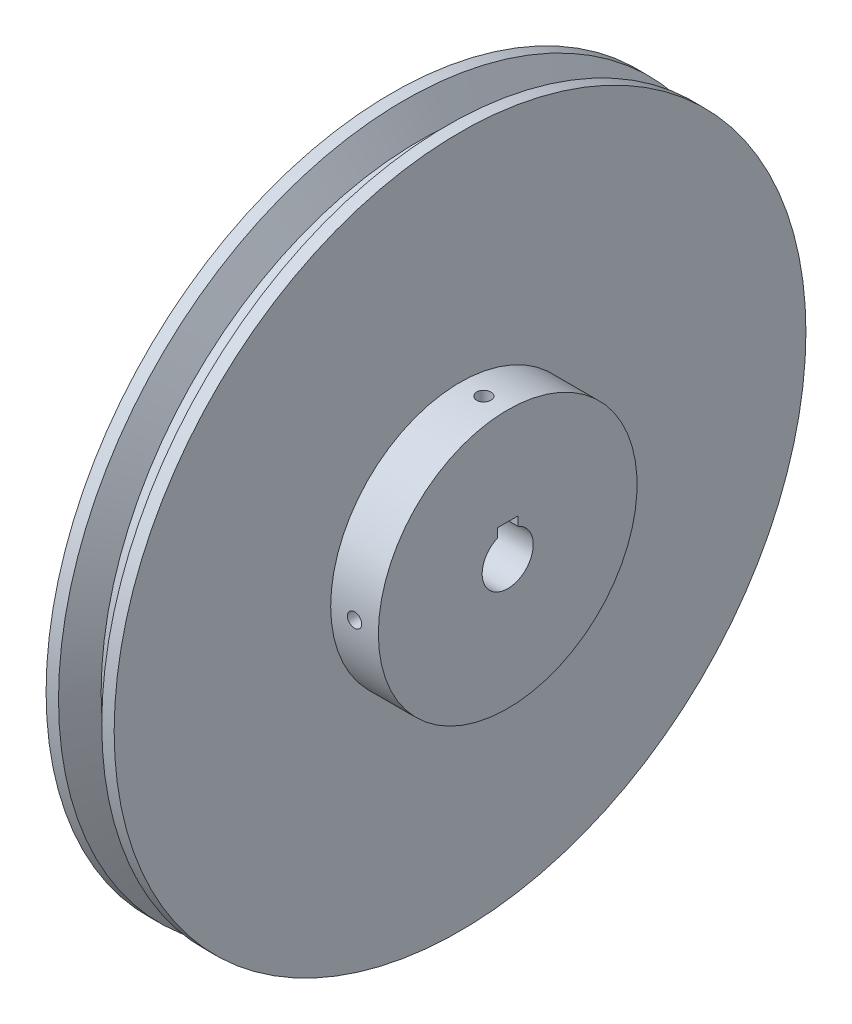
ISO-10303-21;
HEADER;
FILE_DESCRIPTION(('STEP AP214'),'2;1');
FILE_NAME('part.step','',(''),(''),'','','');
FILE_SCHEMA(('AUTOMOTIVE_DESIGN { 1 0 10303 214 1 1 1 1 }'));
ENDSEC;
DATA;
#1=APPLICATION_CONTEXT('core data for automotive mechanical design processes');
#2=APPLICATION_PROTOCOL_DEFINITION('international standard','automotive_design',2000,#1);
#3=PRODUCT_CONTEXT('',#1,'mechanical');
#4=PRODUCT('Part','Part','',(#3));
#5=PRODUCT_RELATED_PRODUCT_CATEGORY('part','',(#4));
#6=PRODUCT_DEFINITION_FORMATION('','',#4);
#7=PRODUCT_DEFINITION_CONTEXT('part definition',#1,'design');
#8=PRODUCT_DEFINITION('design','',#6,#7);
#9=PRODUCT_DEFINITION_SHAPE('','',#8);
#10=(LENGTH_UNIT() NAMED_UNIT(*) SI_UNIT(.MILLI.,.METRE.));
#11=(NAMED_UNIT(*) PLANE_ANGLE_UNIT() SI_UNIT($,.RADIAN.));
#12=(NAMED_UNIT(*) SI_UNIT($,.STERADIAN.) SOLID_ANGLE_UNIT());
#13=UNCERTAINTY_MEASURE_WITH_UNIT(LENGTH_MEASURE(1.E-05),#10,'distance_accuracy_value','');
#14=(GEOMETRIC_REPRESENTATION_CONTEXT(3) GLOBAL_UNCERTAINTY_ASSIGNED_CONTEXT((#13)) GLOBAL_UNIT_ASSIGNED_CONTEXT((#10,
#11,#12)) REPRESENTATION_CONTEXT('',''));
#15=CARTESIAN_POINT('',(0.,0.,0.));
#16=DIRECTION('',(0.,0.,1.));
#17=DIRECTION('',(1.,0.,0.));
#18=AXIS2_PLACEMENT_3D('',#15,#16,#17);
#19=CARTESIAN_POINT('',(0.,101.6,0.));
#20=DIRECTION('',(1.,0.,0.));
#21=DIRECTION('',(0.,0.,-1.));
#22=AXIS2_PLACEMENT_3D('',#19,#20,#21);
#23=PLANE('',#22);
#24=CARTESIAN_POINT('',(0.,0.,0.));
#25=DIRECTION('',(1.,0.,0.));
#26=DIRECTION('',(0.,0.,-1.));
#27=AXIS2_PLACEMENT_3D('',#24,#25,#26);
#28=CIRCLE('',#27,7.5);
#29=CARTESIAN_POINT('',(0.,6.87386354243376,-3.));
#30=VERTEX_POINT('',#29);
#31=CARTESIAN_POINT('',(0.,6.87386354243376,3.));
#32=VERTEX_POINT('',#31);
#33=EDGE_CURVE('E174',#30,#32,#28,.F.);
#34=ORIENTED_EDGE('',*,*,#33,.F.);
#35=DIRECTION('',(0.,-1.,0.));
#36=VECTOR('',#35,1.);
#37=CARTESIAN_POINT('',(0.,9.49999999999999,-3.));
#38=LINE('',#37,#36);
#39=CARTESIAN_POINT('',(0.,9.49999999999999,-3.));
#40=VERTEX_POINT('',#39);
#41=EDGE_CURVE('E118',#40,#30,#38,.T.);
#42=ORIENTED_EDGE('',*,*,#41,.F.);
#43=DIRECTION('',(0.,0.,-1.));
#44=VECTOR('',#43,1.);
#45=CARTESIAN_POINT('',(0.,9.49999999999999,3.));
#46=LINE('',#45,#44);
#47=CARTESIAN_POINT('',(0.,9.49999999999999,3.));
#48=VERTEX_POINT('',#47);
#49=EDGE_CURVE('E115',#48,#40,#46,.T.);
#50=ORIENTED_EDGE('',*,*,#49,.F.);
#51=DIRECTION('',(0.,1.,0.));
#52=VECTOR('',#51,1.);
#53=CARTESIAN_POINT('',(0.,9.49999999999999,3.));
#54=LINE('',#53,#52);
#55=EDGE_CURVE('E93',#32,#48,#54,.T.);
#56=ORIENTED_EDGE('',*,*,#55,.F.);
#57=EDGE_LOOP('',(#34,#42,#50,#56));
#58=FACE_BOUND('',#57,.T.);
#59=CARTESIAN_POINT('',(0.,0.,0.));
#60=DIRECTION('',(-1.,0.,0.));
#61=DIRECTION('',(0.,0.,1.));
#62=AXIS2_PLACEMENT_3D('',#59,#60,#61);
#63=CIRCLE('',#62,101.6);
#64=CARTESIAN_POINT('',(0.,0.,101.6));
#65=VERTEX_POINT('',#64);
#66=EDGE_CURVE('E117',#65,#65,#63,.T.);
#67=ORIENTED_EDGE('',*,*,#66,.T.);
#68=EDGE_LOOP('',(#67));
#69=FACE_BOUND('',#68,.T.);
#70=ADVANCED_FACE('F42',(#58,#69),#23,.F.);
#71=CARTESIAN_POINT('',(34.,0.,0.));
#72=DIRECTION('',(-1.,0.,0.));
#73=DIRECTION('',(0.,0.,1.));
#74=AXIS2_PLACEMENT_3D('',#71,#72,#73);
#75=PLANE('',#74);
#76=DIRECTION('',(0.,0.,1.));
#77=VECTOR('',#76,1.);
#78=CARTESIAN_POINT('',(34.,9.49999999999999,3.));
#79=LINE('',#78,#77);
#80=CARTESIAN_POINT('',(34.,9.49999999999999,-3.));
#81=VERTEX_POINT('',#80);
#82=CARTESIAN_POINT('',(34.,9.49999999999999,3.));
#83=VERTEX_POINT('',#82);
#84=EDGE_CURVE('E99',#81,#83,#79,.T.);
#85=ORIENTED_EDGE('',*,*,#84,.F.);
#86=DIRECTION('',(0.,1.,0.));
#87=VECTOR('',#86,1.);
#88=CARTESIAN_POINT('',(34.,9.49999999999999,-3.));
#89=LINE('',#88,#87);
#90=CARTESIAN_POINT('',(34.,6.87386354243376,-3.));
#91=VERTEX_POINT('',#90);
#92=EDGE_CURVE('E69',#91,#81,#89,.T.);
#93=ORIENTED_EDGE('',*,*,#92,.F.);
#94=CARTESIAN_POINT('',(34.,0.,0.));
#95=DIRECTION('',(1.,0.,0.));
#96=DIRECTION('',(0.,0.,-1.));
#97=AXIS2_PLACEMENT_3D('',#94,#95,#96);
#98=CIRCLE('',#97,7.5);
#99=CARTESIAN_POINT('',(34.,6.87386354243376,3.));
#100=VERTEX_POINT('',#99);
#101=EDGE_CURVE('E106',#100,#91,#98,.T.);
#102=ORIENTED_EDGE('',*,*,#101,.F.);
#103=DIRECTION('',(0.,-1.,0.));
#104=VECTOR('',#103,1.);
#105=CARTESIAN_POINT('',(34.,9.49999999999999,3.));
#106=LINE('',#105,#104);
#107=EDGE_CURVE('E90',#83,#100,#106,.T.);
#108=ORIENTED_EDGE('',*,*,#107,.F.);
#109=EDGE_LOOP('',(#85,#93,#102,#108));
#110=FACE_BOUND('',#109,.T.);
#111=CARTESIAN_POINT('',(34.,0.,0.));
#112=DIRECTION('',(-1.,0.,0.));
#113=DIRECTION('',(0.,0.,1.));
#114=AXIS2_PLACEMENT_3D('',#111,#112,#113);
#115=CIRCLE('',#114,38.);
#116=CARTESIAN_POINT('',(34.,0.,38.));
#117=VERTEX_POINT('',#116);
#118=EDGE_CURVE('E139',#117,#117,#115,.T.);
#119=ORIENTED_EDGE('',*,*,#118,.F.);
#120=EDGE_LOOP('',(#119));
#121=FACE_BOUND('',#120,.T.);
#122=ADVANCED_FACE('F103',(#110,#121),#75,.F.);
#123=CARTESIAN_POINT('',(0.,0.,0.));
#124=DIRECTION('',(-1.,0.,0.));
#125=DIRECTION('',(0.,0.,1.));
#126=AXIS2_PLACEMENT_3D('',#123,#124,#125);
#127=CYLINDRICAL_SURFACE('',#126,38.);
#128=CARTESIAN_POINT('',(29.1,0.,38.));
#129=CARTESIAN_POINT('',(29.0999948044595,-0.117861406286224,37.9999992256047));
#130=CARTESIAN_POINT('',(29.0900443029812,-0.235805979650325,37.9994457893926));
#131=CARTESIAN_POINT('',(29.0504915676667,-0.468440254121159,37.9972912282948));
#132=CARTESIAN_POINT('',(29.0208662904089,-0.583125973966287,37.9956888749317));
#133=CARTESIAN_POINT('',(28.9428158668859,-0.80583902411076,37.9916178034572));
#134=CARTESIAN_POINT('',(28.8944004341641,-0.913869761313151,37.9891495330435));
#135=CARTESIAN_POINT('',(28.7801592896528,-1.12024204380541,37.9836244663135));
#136=CARTESIAN_POINT('',(28.7143376393927,-1.21858584208709,37.9805678073357));
#137=CARTESIAN_POINT('',(28.5670650526134,-1.40293974175392,37.9742056019444));
#138=CARTESIAN_POINT('',(28.4855976868913,-1.48893671064553,37.9708997961444));
#139=CARTESIAN_POINT('',(28.3093795452574,-1.64604371542038,37.9644141081666));
#140=CARTESIAN_POINT('',(28.2146282221418,-1.7171531377425,37.961234231183));
#141=CARTESIAN_POINT('',(28.0144602749357,-1.84250477802772,37.9553570749551));
#142=CARTESIAN_POINT('',(27.9090370216073,-1.89673642550841,37.9526600985967));
#143=CARTESIAN_POINT('',(27.6905643718308,-1.98672535261113,37.9480561340851));
#144=CARTESIAN_POINT('',(27.5775150427578,-2.02248279542566,37.9461491389536));
#145=CARTESIAN_POINT('',(27.347122885297,-2.07447274703244,37.943342592569));
#146=CARTESIAN_POINT('',(27.2297846051662,-2.09072535443484,37.9424420043376));
#147=CARTESIAN_POINT('',(26.9940421251191,-2.10330630910962,37.9417467205119));
#148=CARTESIAN_POINT('',(26.875637935066,-2.09963484055551,37.941952014695));
#149=CARTESIAN_POINT('',(26.6412614398273,-2.07248857592332,37.9434443814958));
#150=CARTESIAN_POINT('',(26.5252866094133,-2.04903550795875,37.9447302671857));
#151=CARTESIAN_POINT('',(26.2989224954186,-1.98302547506737,37.9482370239204));
#152=CARTESIAN_POINT('',(26.1885332393376,-1.94046841609473,37.950457899568));
#153=CARTESIAN_POINT('',(25.9764038915114,-1.83743368303561,37.9555857051114));
#154=CARTESIAN_POINT('',(25.8746686113562,-1.77694612236974,37.9584930133142));
#155=CARTESIAN_POINT('',(25.6827877216894,-1.63977459127154,37.9646656379043));
#156=CARTESIAN_POINT('',(25.5926422131013,-1.56309047981551,37.9679309574088));
#157=CARTESIAN_POINT('',(25.4263733211423,-1.39558010669002,37.9744568660457));
#158=CARTESIAN_POINT('',(25.350268887579,-1.30473503389953,37.9777174429778));
#159=CARTESIAN_POINT('',(25.2143885500826,-1.11154754050822,37.983862178087));
#160=CARTESIAN_POINT('',(25.1546126507767,-1.00920511664917,37.9867463361573));
#161=CARTESIAN_POINT('',(25.0530879319943,-0.795916798926525,37.9918133689919));
#162=CARTESIAN_POINT('',(25.0113397960378,-0.684970579039343,37.9939962171654));
#163=CARTESIAN_POINT('',(24.9470681733292,-0.457629026215466,37.9974142589131));
#164=CARTESIAN_POINT('',(24.9245445109156,-0.341233743079254,37.9986494611464));
#165=CARTESIAN_POINT('',(24.899384604186,-0.106462569588873,38.0000318961266));
#166=CARTESIAN_POINT('',(24.8967221532027,0.0119105041888549,38.0001805625413));
#167=CARTESIAN_POINT('',(24.911291823007,0.24742166957127,37.9993769810637));
#168=CARTESIAN_POINT('',(24.9285238631502,0.364559766180129,37.998424737634));
#169=CARTESIAN_POINT('',(24.9823716670109,0.594202268843593,37.9955274911821));
#170=CARTESIAN_POINT('',(25.0189754420315,0.706709494469171,37.9935831022015));
#171=CARTESIAN_POINT('',(25.1105155065205,0.923983512403246,37.9889204122303));
#172=CARTESIAN_POINT('',(25.1654519250175,1.02875025022643,37.9862021057927));
#173=CARTESIAN_POINT('',(25.2921647786994,1.22768955561941,37.9802936633617));
#174=CARTESIAN_POINT('',(25.3639587558168,1.32185093521826,37.9771030371604));
#175=CARTESIAN_POINT('',(25.5223231680557,1.49679408365154,37.970610820907));
#176=CARTESIAN_POINT('',(25.6088937178835,1.57757574861359,37.9673092299937));
#177=CARTESIAN_POINT('',(25.7944667239342,1.72355481844489,37.9609630868509));
#178=CARTESIAN_POINT('',(25.893482543435,1.78873524944703,37.9579188168897));
#179=CARTESIAN_POINT('',(26.1010680171337,1.9015455726431,37.9524350715635));
#180=CARTESIAN_POINT('',(26.209637622886,1.94917555382576,37.9499955931321));
#181=CARTESIAN_POINT('',(26.4331862415393,2.02550341958375,37.945998550478));
#182=CARTESIAN_POINT('',(26.5481615690278,2.05421207066311,37.9444404847908));
#183=CARTESIAN_POINT('',(26.7813093244207,2.0919175362439,37.9423805667294));
#184=CARTESIAN_POINT('',(26.8994817288286,2.10091449557383,37.941878706595));
#185=CARTESIAN_POINT('',(27.1355002846559,2.09893982133107,37.9419879826966));
#186=CARTESIAN_POINT('',(27.2533466610407,2.08799488246397,37.9425976310412));
#187=CARTESIAN_POINT('',(27.4855259024141,2.04650234633833,37.944858069384));
#188=CARTESIAN_POINT('',(27.5998587608257,2.01595471238794,37.946508861331));
#189=CARTESIAN_POINT('',(27.821770376502,1.93612962323828,37.9506651928065));
#190=CARTESIAN_POINT('',(27.9293491180851,1.88685212455408,37.9531707343195));
#191=CARTESIAN_POINT('',(28.1347088805523,1.77097025744773,37.9587541223566));
#192=CARTESIAN_POINT('',(28.2324901834514,1.70436638795625,37.9618319524003));
#193=CARTESIAN_POINT('',(28.4156137795576,1.55562524142196,37.9682177943665));
#194=CARTESIAN_POINT('',(28.5009406656919,1.47346900856208,37.971526084039));
#195=CARTESIAN_POINT('',(28.6566190986752,1.29597431712916,37.9779978358498));
#196=CARTESIAN_POINT('',(28.7269669643172,1.20063262760512,37.9811612622373));
#197=CARTESIAN_POINT('',(28.850730729081,0.999385382169709,37.9869894376041));
#198=CARTESIAN_POINT('',(28.9041284755418,0.893468659420903,37.9896536507108));
#199=CARTESIAN_POINT('',(28.9923185286495,0.67423692468152,37.9941755455184));
#200=CARTESIAN_POINT('',(29.0271327380729,0.560930799549485,37.9960341762));
#201=CARTESIAN_POINT('',(29.068068428033,0.372437422303132,37.9982456618853));
#202=CARTESIAN_POINT('',(29.0800274028364,0.298470114017334,37.9989006346701));
#203=CARTESIAN_POINT('',(29.0959948345231,0.149679719273224,37.9997780494173));
#204=CARTESIAN_POINT('',(29.1000032998136,0.0748566337199295,38.0000004918372));
#205=CARTESIAN_POINT('',(29.1,0.,38.));
#206=B_SPLINE_CURVE_WITH_KNOTS('',3,(#128,#129,#130,#131,#132,#133,#134,#135,#136,#137,#138,
#139,#140,#141,#142,#143,#144,#145,#146,#147,#148,#149,#150,#151,#152,#153,#154,#155,#156,#157,
#158,#159,#160,#161,#162,#163,#164,#165,#166,#167,#168,#169,#170,#171,#172,#173,#174,#175,#176,
#177,#178,#179,#180,#181,#182,#183,#184,#185,#186,#187,#188,#189,#190,#191,#192,#193,#194,#195,
#196,#197,#198,#199,#200,#201,#202,#203,#204,#205),.UNSPECIFIED.,.T.,.F.,(4,2,2,2,2,2,2,2,2,2,2,
2,2,2,2,2,2,2,2,2,2,2,2,2,2,2,2,2,2,2,2,2,2,2,2,2,2,2,4),(0.,0.353310957756745,
0.707036450618999,1.06057932864983,1.41403978442469,1.76787345055604,2.1217216963805,
2.47579111202024,2.82985739992275,3.18355852876714,3.53725638808667,3.89056625076461,
4.24387785274859,4.59738462836473,4.95089448209831,5.30487799677004,5.65886161175661,
6.01285864680212,6.36685244720301,6.72037907361017,7.07390426696373,7.42721092755906,
7.78052007484424,8.13419851694269,8.48787970466764,8.84194395976453,9.19600641957038,
9.54986723850102,9.90372545748716,10.2571103412979,10.6104958865682,10.9638822522949,
11.3172584430237,11.6710681481692,12.0249647046093,12.3792389963416,12.7330948090562,
12.9574913927578,13.1818877391734),.UNSPECIFIED.);
#207=CARTESIAN_POINT('',(29.1,0.,38.));
#208=VERTEX_POINT('',#207);
#209=EDGE_CURVE('E12',#208,#208,#206,.T.);
#210=ORIENTED_EDGE('',*,*,#209,.T.);
#211=EDGE_LOOP('',(#210));
#212=FACE_BOUND('',#211,.T.);
#213=CARTESIAN_POINT('',(27.,37.9419293130963,2.09999999999999));
#214=CARTESIAN_POINT('',(26.8821387486863,37.9419300919212,2.09999480431885));
#215=CARTESIAN_POINT('',(26.7641943297696,37.942484396079,2.09004432812238));
#216=CARTESIAN_POINT('',(26.5315603762173,37.9446420581342,2.0504917023654));
#217=CARTESIAN_POINT('',(26.4168748229643,37.9462466461413,2.02086650885769));
#218=CARTESIAN_POINT('',(26.1941621249731,37.9503225672217,1.94281633036523));
#219=CARTESIAN_POINT('',(26.0861315719207,37.9527934522142,1.89440106291848));
#220=CARTESIAN_POINT('',(25.8797595975584,37.958322984998,1.78016030753325));
#221=CARTESIAN_POINT('',(25.7814159234897,37.9613814956419,1.71433888071427));
#222=CARTESIAN_POINT('',(25.597061881837,37.9677458441019,1.56706651892178));
#223=CARTESIAN_POINT('',(25.5110646865022,37.9710519404264,1.48559910489744));
#224=CARTESIAN_POINT('',(25.3539572451828,37.9775365092652,1.30938077181535));
#225=CARTESIAN_POINT('',(25.2828476120657,37.9807149765212,1.21462930616892));
#226=CARTESIAN_POINT('',(25.1574957526975,37.9865882225563,1.01446123579756));
#227=CARTESIAN_POINT('',(25.1032640578386,37.989282698896,0.909038026329303));
#228=CARTESIAN_POINT('',(25.0132750310184,37.9938816775059,0.690565471925294));
#229=CARTESIAN_POINT('',(24.977517536438,37.9957861867297,0.577516194127932));
#230=CARTESIAN_POINT('',(24.9255274746651,37.9985888695532,0.347124186685941));
#231=CARTESIAN_POINT('',(24.9092748050173,37.9994880791894,0.229786006145751));
#232=CARTESIAN_POINT('',(24.8966936913531,38.0001823165008,-0.00595627942071624));
#233=CARTESIAN_POINT('',(24.9003650638216,37.9999773543462,-0.124360374619109));
#234=CARTESIAN_POINT('',(24.9275111777874,37.9984872133426,-0.358737297528129));
#235=CARTESIAN_POINT('',(24.9509642878532,37.9972032144314,-0.47471263918483));
#236=CARTESIAN_POINT('',(25.0169745827306,37.9937009580621,-0.701077753977657));
#237=CARTESIAN_POINT('',(25.0595318606487,37.9914826960508,-0.811467499888768));
#238=CARTESIAN_POINT('',(25.1625670440235,37.9863597101382,-1.02359743580868));
#239=CARTESIAN_POINT('',(25.2230547844761,37.9834546096782,-1.12533283932799));
#240=CARTESIAN_POINT('',(25.3602266976804,37.9772850223004,-1.31721389918692));
#241=CARTESIAN_POINT('',(25.4369110115661,37.974020532251,-1.4073594545236));
#242=CARTESIAN_POINT('',(25.6044215264881,37.9674945512852,-1.5736281123833));
#243=CARTESIAN_POINT('',(25.6952664977784,37.964233070214,-1.64973230612479));
#244=CARTESIAN_POINT('',(25.8884537032978,37.9580851773243,-1.78561220837629));
#245=CARTESIAN_POINT('',(25.9907959411249,37.9551987656232,-1.84538791177658));
#246=CARTESIAN_POINT('',(26.204084212284,37.950126855585,-1.94691249028181));
#247=CARTESIAN_POINT('',(26.3150306008117,37.9479413862031,-1.98866062070632));
#248=CARTESIAN_POINT('',(26.5423725196185,37.9445188957623,-2.05293218050495));
#249=CARTESIAN_POINT('',(26.6587679998133,37.9432818659877,-2.07545578654077));
#250=CARTESIAN_POINT('',(26.8935392588511,37.9418973771135,-2.10061548123324));
#251=CARTESIAN_POINT('',(27.0119122153596,37.9417484793091,-2.1032778301173));
#252=CARTESIAN_POINT('',(27.2474231215409,37.94255328884,-2.08870799798795));
#253=CARTESIAN_POINT('',(27.3645610762175,37.9435069917065,-2.07147589761004));
#254=CARTESIAN_POINT('',(27.5942029038308,37.9464082037545,-2.01762811618953));
#255=CARTESIAN_POINT('',(27.7067096105623,37.9483550951479,-1.98102448419719));
#256=CARTESIAN_POINT('',(27.9239826541538,37.9530227400398,-1.88948487993032));
#257=CARTESIAN_POINT('',(28.0287489361753,37.9557434990204,-1.83454877779084));
#258=CARTESIAN_POINT('',(28.2276879404666,37.9616557407806,-1.70783638436471));
#259=CARTESIAN_POINT('',(28.3218494234853,37.9648477148426,-1.63604247066));
#260=CARTESIAN_POINT('',(28.496792810202,37.9713409178002,-1.47767812670853));
#261=CARTESIAN_POINT('',(28.5775746104695,37.9746421475403,-1.39110758224286));
#262=CARTESIAN_POINT('',(28.723553959225,37.9809860164885,-1.20553451520365));
#263=CARTESIAN_POINT('',(28.7887345332169,37.9840283717373,-1.10651862877897));
#264=CARTESIAN_POINT('',(28.9015451075804,37.9895075722488,-0.898932984379272));
#265=CARTESIAN_POINT('',(28.9491751969506,37.991944420582,-0.79036327485518));
#266=CARTESIAN_POINT('',(29.0255031372842,37.9959366386492,-0.566814732644533));
#267=CARTESIAN_POINT('',(29.0542118015502,37.9974925117753,-0.451839601376189));
#268=CARTESIAN_POINT('',(29.0919173600404,37.999549450562,-0.218692258726073));
#269=CARTESIAN_POINT('',(29.1009143980538,38.0000505239171,-0.100520070672032));
#270=CARTESIAN_POINT('',(29.0989399475915,37.9999414268934,0.135498631038657));
#271=CARTESIAN_POINT('',(29.08799506006,37.99933273685,0.253345368839822));
#272=CARTESIAN_POINT('',(29.0465024991919,37.9970755339892,0.485525345520761));
#273=CARTESIAN_POINT('',(29.0159547898109,37.9954270192599,0.599858577939732));
#274=CARTESIAN_POINT('',(28.9361294150724,37.9912755645642,0.821770922848952));
#275=CARTESIAN_POINT('',(28.8868517057828,37.9887726225937,0.929350019496412));
#276=CARTESIAN_POINT('',(28.7709693080185,37.9831936187473,1.13471040379687));
#277=CARTESIAN_POINT('',(28.7043651188591,37.9801175733878,1.23249197368307));
#278=CARTESIAN_POINT('',(28.5556236271365,37.9737337223408,1.41561553892637));
#279=CARTESIAN_POINT('',(28.4734674414032,37.9704256380185,1.50094218614717));
#280=CARTESIAN_POINT('',(28.2959729416209,37.9639526108721,1.65662015918218));
#281=CARTESIAN_POINT('',(28.200631396102,37.9607877033909,1.72696780317332));
#282=CARTESIAN_POINT('',(27.9993842614577,37.9549555182671,1.85073133667557));
#283=CARTESIAN_POINT('',(27.8934674798378,37.9522887766207,1.90412903176097));
#284=CARTESIAN_POINT('',(27.6742356189689,37.9477619020307,1.99231897236973));
#285=CARTESIAN_POINT('',(27.5609294269125,37.9459008199847,2.02713312146417));
#286=CARTESIAN_POINT('',(27.3724362118219,37.9436862626251,2.06806863671959));
#287=CARTESIAN_POINT('',(27.2984691449627,37.9430303273814,2.08002753302229));
#288=CARTESIAN_POINT('',(27.1496792342123,37.9421516055224,2.09599486038541));
#289=CARTESIAN_POINT('',(27.0748563912308,37.9419288184468,2.10000329989657));
#290=CARTESIAN_POINT('',(27.,37.9419293130963,2.09999999999999));
#291=B_SPLINE_CURVE_WITH_KNOTS('',3,(#213,#214,#215,#216,#217,#218,#219,#220,#221,#222,#223,
#224,#225,#226,#227,#228,#229,#230,#231,#232,#233,#234,#235,#236,#237,#238,#239,#240,#241,#242,
#243,#244,#245,#246,#247,#248,#249,#250,#251,#252,#253,#254,#255,#256,#257,#258,#259,#260,#261,
#262,#263,#264,#265,#266,#267,#268,#269,#270,#271,#272,#273,#274,#275,#276,#277,#278,#279,#280,
#281,#282,#283,#284,#285,#286,#287,#288,#289,#290),.UNSPECIFIED.,.T.,.F.,(4,2,2,2,2,2,2,2,2,2,2,
2,2,2,2,2,2,2,2,2,2,2,2,2,2,2,2,2,2,2,2,2,2,2,2,2,2,2,4),(0.,0.353310492330027,
0.707035529926583,1.06057787713478,1.41403781024632,1.7678720852464,2.12172092346882,
2.47579011348128,2.82985618674552,3.18355703105422,3.53725461752419,3.89056593455027,
4.24387897350177,4.5973861670844,4.95089644119458,5.30487934914118,5.6588623678607,
6.01286000746216,6.36685439400539,6.72038065190163,7.07390547690248,7.42721066822933,
7.78051836237978,8.13419704622402,8.48787846402169,8.84194296375361,9.19600566799829,
9.54986585501536,9.9037234607426,10.2571093940608,10.6104959771631,10.9638833891532,
11.3172606183334,11.6710697012607,12.0249656499488,12.379240203232,12.7330962621776,
12.9574921196525,13.1818877386114),.UNSPECIFIED.);
#292=CARTESIAN_POINT('',(27.,37.9419293130963,2.09999999999999));
#293=VERTEX_POINT('',#292);
#294=EDGE_CURVE('E54',#293,#293,#291,.T.);
#295=ORIENTED_EDGE('',*,*,#294,.T.);
#296=EDGE_LOOP('',(#295));
#297=FACE_BOUND('',#296,.T.);
#298=CARTESIAN_POINT('',(20.,0.,0.));
#299=DIRECTION('',(-1.,0.,0.));
#300=DIRECTION('',(0.,0.,1.));
#301=AXIS2_PLACEMENT_3D('',#298,#299,#300);
#302=CIRCLE('',#301,38.);
#303=CARTESIAN_POINT('',(20.,0.,38.));
#304=VERTEX_POINT('',#303);
#305=EDGE_CURVE('E136',#304,#304,#302,.T.);
#306=ORIENTED_EDGE('',*,*,#305,.F.);
#307=EDGE_LOOP('',(#306));
#308=FACE_BOUND('',#307,.T.);
#309=ORIENTED_EDGE('',*,*,#118,.T.);
#310=EDGE_LOOP('',(#309));
#311=FACE_BOUND('',#310,.T.);
#312=ADVANCED_FACE('F146',(#212,#297,#308,#311),#127,.T.);
#313=CARTESIAN_POINT('',(20.,38.,0.));
#314=DIRECTION('',(-1.,0.,0.));
#315=DIRECTION('',(0.,0.,1.));
#316=AXIS2_PLACEMENT_3D('',#313,#314,#315);
#317=PLANE('',#316);
#318=CARTESIAN_POINT('',(20.,0.,0.));
#319=DIRECTION('',(-1.,0.,0.));
#320=DIRECTION('',(0.,0.,1.));
#321=AXIS2_PLACEMENT_3D('',#318,#319,#320);
#322=CIRCLE('',#321,101.6);
#323=CARTESIAN_POINT('',(20.,0.,101.6));
#324=VERTEX_POINT('',#323);
#325=EDGE_CURVE('E133',#324,#324,#322,.T.);
#326=ORIENTED_EDGE('',*,*,#325,.F.);
#327=EDGE_LOOP('',(#326));
#328=FACE_BOUND('',#327,.T.);
#329=ORIENTED_EDGE('',*,*,#305,.T.);
#330=EDGE_LOOP('',(#329));
#331=FACE_BOUND('',#330,.T.);
#332=ADVANCED_FACE('F212',(#328,#331),#317,.F.);
#333=CARTESIAN_POINT('',(0.,0.,0.));
#334=DIRECTION('',(-1.,0.,0.));
#335=DIRECTION('',(0.,0.,1.));
#336=AXIS2_PLACEMENT_3D('',#333,#334,#335);
#337=CYLINDRICAL_SURFACE('',#336,101.6);
#338=CARTESIAN_POINT('',(16.35,0.,0.));
#339=DIRECTION('',(-1.,0.,0.));
#340=DIRECTION('',(0.,0.,1.));
#341=AXIS2_PLACEMENT_3D('',#338,#339,#340);
#342=CIRCLE('',#341,101.6);
#343=CARTESIAN_POINT('',(16.35,0.,101.6));
#344=VERTEX_POINT('',#343);
#345=EDGE_CURVE('E130',#344,#344,#342,.T.);
#346=ORIENTED_EDGE('',*,*,#345,.F.);
#347=EDGE_LOOP('',(#346));
#348=FACE_BOUND('',#347,.T.);
#349=ORIENTED_EDGE('',*,*,#325,.T.);
#350=EDGE_LOOP('',(#349));
#351=FACE_BOUND('',#350,.T.);
#352=ADVANCED_FACE('F206',(#348,#351),#337,.T.);
#353=CARTESIAN_POINT('',(16.35,0.,0.));
#354=DIRECTION('',(1.,0.,0.));
#355=DIRECTION('',(0.,0.,-1.));
#356=AXIS2_PLACEMENT_3D('',#353,#354,#355);
#357=CONICAL_SURFACE('',#356,101.6,1.0471975511966);
#358=CARTESIAN_POINT('',(11.7672822383074,0.,0.));
#359=DIRECTION('',(-1.,0.,0.));
#360=DIRECTION('',(0.,0.,1.));
#361=AXIS2_PLACEMENT_3D('',#358,#359,#360);
#362=CIRCLE('',#361,93.6625);
#363=CARTESIAN_POINT('',(11.7672822383074,0.,93.6625));
#364=VERTEX_POINT('',#363);
#365=EDGE_CURVE('E127',#364,#364,#362,.T.);
#366=ORIENTED_EDGE('',*,*,#365,.F.);
#367=EDGE_LOOP('',(#366));
#368=FACE_BOUND('',#367,.T.);
#369=ORIENTED_EDGE('',*,*,#345,.T.);
#370=EDGE_LOOP('',(#369));
#371=FACE_BOUND('',#370,.T.);
#372=ADVANCED_FACE('F200',(#368,#371),#357,.T.);
#373=CARTESIAN_POINT('',(0.,0.,0.));
#374=DIRECTION('',(-1.,0.,0.));
#375=DIRECTION('',(0.,0.,1.));
#376=AXIS2_PLACEMENT_3D('',#373,#374,#375);
#377=CYLINDRICAL_SURFACE('',#376,93.6625);
#378=CARTESIAN_POINT('',(8.23271776169262,0.,0.));
#379=DIRECTION('',(-1.,0.,0.));
#380=DIRECTION('',(0.,0.,1.));
#381=AXIS2_PLACEMENT_3D('',#378,#379,#380);
#382=CIRCLE('',#381,93.6625);
#383=CARTESIAN_POINT('',(8.23271776169262,0.,93.6625));
#384=VERTEX_POINT('',#383);
#385=EDGE_CURVE('E124',#384,#384,#382,.T.);
#386=ORIENTED_EDGE('',*,*,#385,.F.);
#387=EDGE_LOOP('',(#386));
#388=FACE_BOUND('',#387,.T.);
#389=ORIENTED_EDGE('',*,*,#365,.T.);
#390=EDGE_LOOP('',(#389));
#391=FACE_BOUND('',#390,.T.);
#392=ADVANCED_FACE('F194',(#388,#391),#377,.T.);
#393=CARTESIAN_POINT('',(8.23271776169262,0.,0.));
#394=DIRECTION('',(-1.,0.,0.));
#395=DIRECTION('',(0.,0.,1.));
#396=AXIS2_PLACEMENT_3D('',#393,#394,#395);
#397=CONICAL_SURFACE('',#396,93.6625,1.0471975511966);
#398=CARTESIAN_POINT('',(3.64999999999999,0.,0.));
#399=DIRECTION('',(-1.,0.,0.));
#400=DIRECTION('',(0.,0.,1.));
#401=AXIS2_PLACEMENT_3D('',#398,#399,#400);
#402=CIRCLE('',#401,101.6);
#403=CARTESIAN_POINT('',(3.64999999999999,0.,101.6));
#404=VERTEX_POINT('',#403);
#405=EDGE_CURVE('E121',#404,#404,#402,.T.);
#406=ORIENTED_EDGE('',*,*,#405,.F.);
#407=EDGE_LOOP('',(#406));
#408=FACE_BOUND('',#407,.T.);
#409=ORIENTED_EDGE('',*,*,#385,.T.);
#410=EDGE_LOOP('',(#409));
#411=FACE_BOUND('',#410,.T.);
#412=ADVANCED_FACE('F188',(#408,#411),#397,.T.);
#413=CARTESIAN_POINT('',(0.,0.,0.));
#414=DIRECTION('',(-1.,0.,0.));
#415=DIRECTION('',(0.,0.,1.));
#416=AXIS2_PLACEMENT_3D('',#413,#414,#415);
#417=CYLINDRICAL_SURFACE('',#416,101.6);
#418=ORIENTED_EDGE('',*,*,#66,.F.);
#419=EDGE_LOOP('',(#418));
#420=FACE_BOUND('',#419,.T.);
#421=ORIENTED_EDGE('',*,*,#405,.T.);
#422=EDGE_LOOP('',(#421));
#423=FACE_BOUND('',#422,.T.);
#424=ADVANCED_FACE('F185',(#420,#423),#417,.T.);
#425=CARTESIAN_POINT('',(-22.6715680975093,9.49999999999999,-3.));
#426=DIRECTION('',(0.,0.,-1.));
#427=DIRECTION('',(0.,1.,0.));
#428=AXIS2_PLACEMENT_3D('',#425,#426,#427);
#429=PLANE('',#428);
#430=ORIENTED_EDGE('',*,*,#41,.T.);
#431=DIRECTION('',(1.,0.,0.));
#432=VECTOR('',#431,1.);
#433=CARTESIAN_POINT('',(-22.6715680975093,6.87386354243376,-3.));
#434=LINE('',#433,#432);
#435=EDGE_CURVE('E111',#30,#91,#434,.T.);
#436=ORIENTED_EDGE('',*,*,#435,.T.);
#437=ORIENTED_EDGE('',*,*,#92,.T.);
#438=DIRECTION('',(1.,0.,0.));
#439=VECTOR('',#438,1.);
#440=CARTESIAN_POINT('',(-22.6715680975093,9.49999999999999,-3.));
#441=LINE('',#440,#439);
#442=EDGE_CURVE('E96',#40,#81,#441,.T.);
#443=ORIENTED_EDGE('',*,*,#442,.F.);
#444=EDGE_LOOP('',(#430,#436,#437,#443));
#445=FACE_BOUND('',#444,.T.);
#446=ADVANCED_FACE('F160',(#445),#429,.F.);
#447=CARTESIAN_POINT('',(-22.6715680975093,0.,0.));
#448=DIRECTION('',(1.,0.,0.));
#449=DIRECTION('',(0.,0.,-1.));
#450=AXIS2_PLACEMENT_3D('',#447,#448,#449);
#451=CYLINDRICAL_SURFACE('',#450,7.5);
#452=CARTESIAN_POINT('',(29.1,0.,7.49999999999999));
#453=CARTESIAN_POINT('',(29.0999977340683,0.115549071859457,7.49999850044543));
#454=CARTESIAN_POINT('',(29.0904312983852,0.231121705110065,7.4973036885812));
#455=CARTESIAN_POINT('',(29.0524949173941,0.458923495634751,7.4868158263674));
#456=CARTESIAN_POINT('',(29.0241172665758,0.571151263080414,7.47902068682222));
#457=CARTESIAN_POINT('',(28.9495640201166,0.788943238195506,7.45919014801396));
#458=CARTESIAN_POINT('',(28.9034126714867,0.894516296930382,7.4471605273756));
#459=CARTESIAN_POINT('',(28.7947157318247,1.09642476541401,7.420124150391));
#460=CARTESIAN_POINT('',(28.7321686125134,1.19275931288064,7.40511711654645));
#461=CARTESIAN_POINT('',(28.5907831413099,1.37589761639295,7.37331332850794));
#462=CARTESIAN_POINT('',(28.5116058280895,1.46243395483419,7.35648356700851));
#463=CARTESIAN_POINT('',(28.3399312338879,1.62118994975329,7.32313712362264));
#464=CARTESIAN_POINT('',(28.2474320486357,1.69340755595235,7.30662048687786));
#465=CARTESIAN_POINT('',(28.0495555118287,1.82281954418509,7.27542837897222));
#466=CARTESIAN_POINT('',(27.9439651052421,1.87969906189857,7.26079431852522));
#467=CARTESIAN_POINT('',(27.7242430501572,1.97478943248913,7.23551274440862));
#468=CARTESIAN_POINT('',(27.6101131632707,2.01300412356119,7.22486441122792));
#469=CARTESIAN_POINT('',(27.3795301714627,2.06873752873864,7.20910195955085));
#470=CARTESIAN_POINT('',(27.2632041712619,2.08674433574883,7.20385758469793));
#471=CARTESIAN_POINT('',(27.0290732443517,2.10307354988689,7.19910829329382));
#472=CARTESIAN_POINT('',(26.9112686300798,2.10140004786119,7.1996021839581));
#473=CARTESIAN_POINT('',(26.6813944387992,2.07880203719544,7.20615747477845));
#474=CARTESIAN_POINT('',(26.5692602936321,2.05847601372621,7.2120457798225));
#475=CARTESIAN_POINT('',(26.3500614648778,2.00011173806163,7.22844816907821));
#476=CARTESIAN_POINT('',(26.2429972242109,1.96207194147722,7.23896265662278));
#477=CARTESIAN_POINT('',(26.0354547701562,1.86889065894203,7.2635793822286));
#478=CARTESIAN_POINT('',(25.9350732369257,1.81354549979215,7.27772396889439));
#479=CARTESIAN_POINT('',(25.7448156066742,1.68746638599935,7.30798533076004));
#480=CARTESIAN_POINT('',(25.654941772771,1.61672912560208,7.32410252929097));
#481=CARTESIAN_POINT('',(25.4848406076291,1.4588475528645,7.35720651544555));
#482=CARTESIAN_POINT('',(25.4050790082679,1.37120287335206,7.37420368441479));
#483=CARTESIAN_POINT('',(25.2612853049702,1.18357169751816,7.40663279030198));
#484=CARTESIAN_POINT('',(25.1972539532914,1.08358461129691,7.42206465234252));
#485=CARTESIAN_POINT('',(25.0865038081177,0.873337450332598,7.44973605200326));
#486=CARTESIAN_POINT('',(25.0398766273177,0.763026733669777,7.46195859911619));
#487=CARTESIAN_POINT('',(24.9659673387535,0.53571018371985,7.48171171416257));
#488=CARTESIAN_POINT('',(24.938680554894,0.418705976174602,7.48924341618883));
#489=CARTESIAN_POINT('',(24.9049748769127,0.185292401498555,7.498591647067));
#490=CARTESIAN_POINT('',(24.8979235914578,0.0689811489871956,7.50058131296794));
#491=CARTESIAN_POINT('',(24.9031325567059,-0.163164639318413,7.49912299982235));
#492=CARTESIAN_POINT('',(24.9153905896642,-0.278999228327221,7.49567564523712));
#493=CARTESIAN_POINT('',(24.9583541024876,-0.504596268732406,7.48384311833654));
#494=CARTESIAN_POINT('',(24.9887003524127,-0.614432648474318,7.47555416236048));
#495=CARTESIAN_POINT('',(25.0665559249828,-0.827440079594194,7.4549851125704));
#496=CARTESIAN_POINT('',(25.1140671973673,-0.930610372215034,7.44270456537565));
#497=CARTESIAN_POINT('',(25.2260335149731,-1.12976408663135,7.41511700690706));
#498=CARTESIAN_POINT('',(25.2908239918027,-1.22555065053476,7.39975176074413));
#499=CARTESIAN_POINT('',(25.4350935103366,-1.40511158541057,7.36776719837964));
#500=CARTESIAN_POINT('',(25.5145757594014,-1.48888332632155,7.35114760881206));
#501=CARTESIAN_POINT('',(25.6889334558994,-1.64474908309541,7.31787944351907));
#502=CARTESIAN_POINT('',(25.7842130475328,-1.71639518266251,7.30124626249003));
#503=CARTESIAN_POINT('',(25.9857997561693,-1.84269980125677,7.27039890541724));
#504=CARTESIAN_POINT('',(26.0921064609252,-1.89735895503358,7.25618463899512));
#505=CARTESIAN_POINT('',(26.3122566986658,-1.98773352270872,7.23195038062151));
#506=CARTESIAN_POINT('',(26.4260548958874,-2.02355287826429,7.22190744096201));
#507=CARTESIAN_POINT('',(26.6583932173263,-2.07544269963814,7.20716859474244));
#508=CARTESIAN_POINT('',(26.7769319650244,-2.09151885593219,7.20247114750862));
#509=CARTESIAN_POINT('',(27.0107756368505,-2.10311465515799,7.19909300510936));
#510=CARTESIAN_POINT('',(27.1260421256435,-2.09935796340976,7.20020048759655));
#511=CARTESIAN_POINT('',(27.3542278974938,-2.07309224060161,7.20780629176382));
#512=CARTESIAN_POINT('',(27.4671472530492,-2.05058378962982,7.21430444668272));
#513=CARTESIAN_POINT('',(27.6864176936546,-1.98789228158041,7.23182691657987));
#514=CARTESIAN_POINT('',(27.7928205480617,-1.94787737568997,7.24280810607179));
#515=CARTESIAN_POINT('',(27.9974856029703,-1.85143886377054,7.26805665519029));
#516=CARTESIAN_POINT('',(28.0957464074128,-1.79501245122781,7.28232457679045));
#517=CARTESIAN_POINT('',(28.2847555918117,-1.66522213518895,7.31311239075332));
#518=CARTESIAN_POINT('',(28.3751604077316,-1.59137155804018,7.32968998213804));
#519=CARTESIAN_POINT('',(28.542529066278,-1.42973554613914,7.36292421204914));
#520=CARTESIAN_POINT('',(28.6194895571519,-1.34194664686119,7.37958086922697));
#521=CARTESIAN_POINT('',(28.759635179466,-1.15235163570581,7.41158138369391));
#522=CARTESIAN_POINT('',(28.8224398452787,-1.05025658819514,7.42688347042849));
#523=CARTESIAN_POINT('',(28.929897916664,-0.836529392791798,7.453978020383));
#524=CARTESIAN_POINT('',(28.9745617796204,-0.724902784475276,7.46577250453007));
#525=CARTESIAN_POINT('',(29.0393389906795,-0.511578272572148,7.48318647397412));
#526=CARTESIAN_POINT('',(29.0620307555927,-0.410708274492527,7.48944328125704));
#527=CARTESIAN_POINT('',(29.0923613529761,-0.206564929983064,7.49785046352107));
#528=CARTESIAN_POINT('',(29.1000020255666,-0.103291878908547,7.50000134048509));
#529=CARTESIAN_POINT('',(29.1,0.,7.49999999999999));
#530=B_SPLINE_CURVE_WITH_KNOTS('',3,(#452,#453,#454,#455,#456,#457,#458,#459,#460,#461,#462,
#463,#464,#465,#466,#467,#468,#469,#470,#471,#472,#473,#474,#475,#476,#477,#478,#479,#480,#481,
#482,#483,#484,#485,#486,#487,#488,#489,#490,#491,#492,#493,#494,#495,#496,#497,#498,#499,#500,
#501,#502,#503,#504,#505,#506,#507,#508,#509,#510,#511,#512,#513,#514,#515,#516,#517,#518,#519,
#520,#521,#522,#523,#524,#525,#526,#527,#528,#529),.UNSPECIFIED.,.T.,.F.,(4,2,2,2,2,2,2,2,2,2,2,
2,2,2,2,2,2,2,2,2,2,2,2,2,2,2,2,2,2,2,2,2,2,2,2,2,2,2,4),(0.,0.346268182086731,
0.692678291376704,1.03861748991142,1.38458894553262,1.73844946991322,2.09236062654245,
2.45306282264885,2.81369081346569,3.16540713829202,3.51705035491517,3.85779089256615,
4.19856114350903,4.5435034244287,4.88851986168953,5.24599927407036,5.60349577863914,
5.96284840125163,6.32211411040285,6.67002301614658,7.01789196621452,7.35907226789233,
7.70029133572953,8.04868889915354,8.39716261126659,8.75655041081177,9.11592477953092,
9.47329506480392,9.83056232297602,10.1748857034315,10.5191984325935,10.8602742217546,
11.2014083722408,11.5535216990377,11.9057226849497,12.2664877844676,12.627044622426,
12.9366192831129,13.2461560933912),.UNSPECIFIED.);
#531=CARTESIAN_POINT('',(29.1,0.,7.49999999999999));
#532=VERTEX_POINT('',#531);
#533=EDGE_CURVE('E164',#532,#532,#530,.T.);
#534=ORIENTED_EDGE('',*,*,#533,.T.);
#535=EDGE_LOOP('',(#534));
#536=FACE_BOUND('',#535,.T.);
#537=ORIENTED_EDGE('',*,*,#33,.T.);
#538=DIRECTION('',(1.,0.,0.));
#539=VECTOR('',#538,1.);
#540=CARTESIAN_POINT('',(-22.6715680975093,6.87386354243376,3.));
#541=LINE('',#540,#539);
#542=EDGE_CURVE('E95',#32,#100,#541,.T.);
#543=ORIENTED_EDGE('',*,*,#542,.T.);
#544=ORIENTED_EDGE('',*,*,#101,.T.);
#545=ORIENTED_EDGE('',*,*,#435,.F.);
#546=EDGE_LOOP('',(#537,#543,#544,#545));
#547=FACE_BOUND('',#546,.T.);
#548=ADVANCED_FACE('F156',(#536,#547),#451,.F.);
#549=CARTESIAN_POINT('',(-22.6715680975093,9.49999999999999,3.));
#550=DIRECTION('',(0.,0.,1.));
#551=DIRECTION('',(0.,-1.,0.));
#552=AXIS2_PLACEMENT_3D('',#549,#550,#551);
#553=PLANE('',#552);
#554=ORIENTED_EDGE('',*,*,#55,.T.);
#555=DIRECTION('',(1.,0.,0.));
#556=VECTOR('',#555,1.);
#557=CARTESIAN_POINT('',(-22.6715680975093,9.49999999999999,3.));
#558=LINE('',#557,#556);
#559=EDGE_CURVE('E61',#48,#83,#558,.T.);
#560=ORIENTED_EDGE('',*,*,#559,.T.);
#561=ORIENTED_EDGE('',*,*,#107,.T.);
#562=ORIENTED_EDGE('',*,*,#542,.F.);
#563=EDGE_LOOP('',(#554,#560,#561,#562));
#564=FACE_BOUND('',#563,.T.);
#565=ADVANCED_FACE('F87',(#564),#553,.F.);
#566=CARTESIAN_POINT('',(-22.6715680975093,9.49999999999999,3.));
#567=DIRECTION('',(0.,1.,0.));
#568=DIRECTION('',(0.,0.,1.));
#569=AXIS2_PLACEMENT_3D('',#566,#567,#568);
#570=PLANE('',#569);
#571=CARTESIAN_POINT('',(27.,9.49999999999999,0.));
#572=DIRECTION('',(0.,1.,0.));
#573=DIRECTION('',(0.,0.,1.));
#574=AXIS2_PLACEMENT_3D('',#571,#572,#573);
#575=CIRCLE('',#574,2.09999999999999);
#576=CARTESIAN_POINT('',(27.,9.49999999999999,2.09999999999999));
#577=VERTEX_POINT('',#576);
#578=EDGE_CURVE('E170',#577,#577,#575,.T.);
#579=ORIENTED_EDGE('',*,*,#578,.T.);
#580=EDGE_LOOP('',(#579));
#581=FACE_BOUND('',#580,.T.);
#582=ORIENTED_EDGE('',*,*,#49,.T.);
#583=ORIENTED_EDGE('',*,*,#442,.T.);
#584=ORIENTED_EDGE('',*,*,#84,.T.);
#585=ORIENTED_EDGE('',*,*,#559,.F.);
#586=EDGE_LOOP('',(#582,#583,#584,#585));
#587=FACE_BOUND('',#586,.T.);
#588=ADVANCED_FACE('F100',(#581,#587),#570,.F.);
#589=CARTESIAN_POINT('',(27.,38.,0.));
#590=DIRECTION('',(0.,1.,0.));
#591=DIRECTION('',(0.,0.,1.));
#592=AXIS2_PLACEMENT_3D('',#589,#590,#591);
#593=CYLINDRICAL_SURFACE('',#592,2.09999999999999);
#594=ORIENTED_EDGE('',*,*,#294,.F.);
#595=EDGE_LOOP('',(#594));
#596=FACE_BOUND('',#595,.T.);
#597=ORIENTED_EDGE('',*,*,#578,.F.);
#598=EDGE_LOOP('',(#597));
#599=FACE_BOUND('',#598,.T.);
#600=ADVANCED_FACE('F149',(#596,#599),#593,.F.);
#601=CARTESIAN_POINT('',(27.,0.,38.));
#602=DIRECTION('',(0.,0.,1.));
#603=DIRECTION('',(1.,0.,0.));
#604=AXIS2_PLACEMENT_3D('',#601,#602,#603);
#605=CYLINDRICAL_SURFACE('',#604,2.09999999999999);
#606=ORIENTED_EDGE('',*,*,#209,.F.);
#607=EDGE_LOOP('',(#606));
#608=FACE_BOUND('',#607,.T.);
#609=ORIENTED_EDGE('',*,*,#533,.F.);
#610=EDGE_LOOP('',(#609));
#611=FACE_BOUND('',#610,.T.);
#612=ADVANCED_FACE('F153',(#608,#611),#605,.F.);
#613=CLOSED_SHELL('',(#70,#122,#312,#332,#352,#372,#392,#412,#424,#446,#548,#565,#588,#600,#612));
#614=MANIFOLD_SOLID_BREP('B2',#613);
#615=ADVANCED_BREP_SHAPE_REPRESENTATION('',(#18,#614),#14);
#616=SHAPE_DEFINITION_REPRESENTATION(#9,#615);
ENDSEC;
END-ISO-10303-21;
